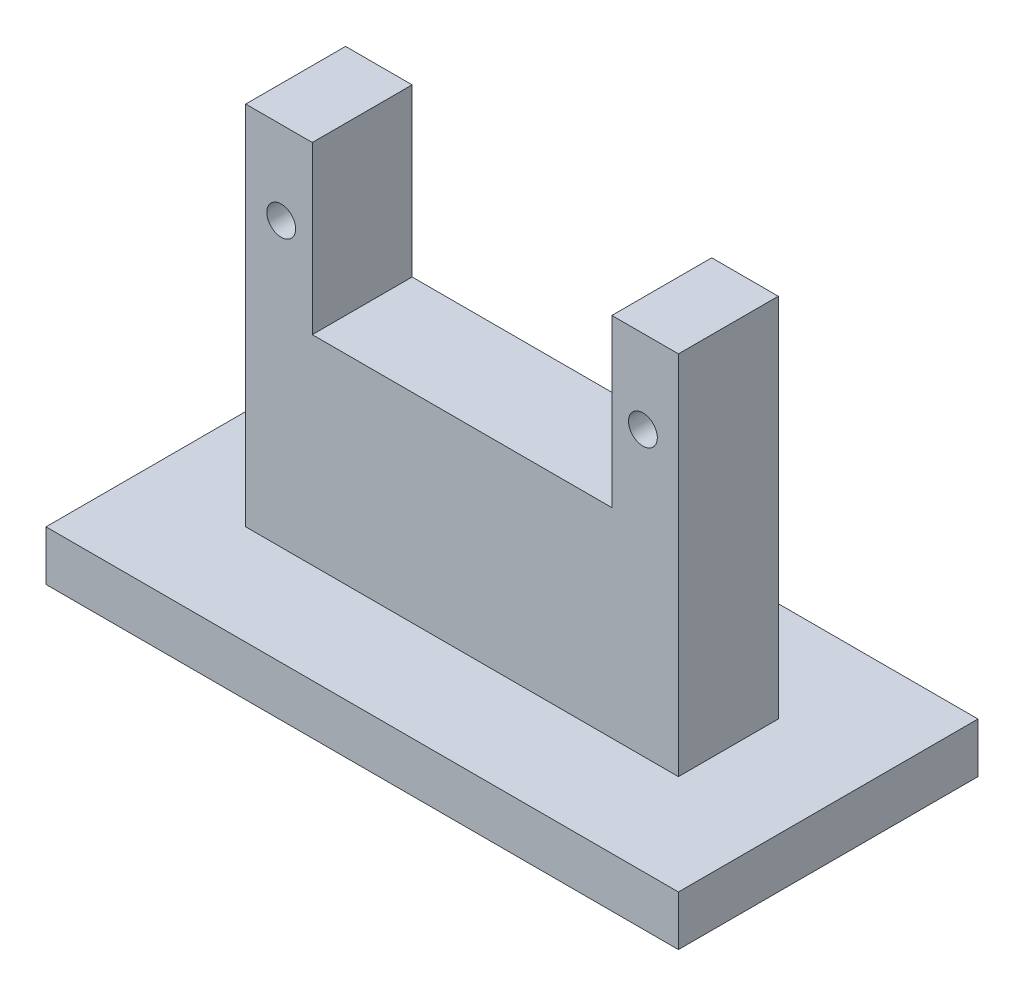
ISO-10303-21;
HEADER;
FILE_DESCRIPTION(('STEP AP214'),'2;1');
FILE_NAME('part.step','',(''),(''),'','','');
FILE_SCHEMA(('AUTOMOTIVE_DESIGN { 1 0 10303 214 1 1 1 1 }'));
ENDSEC;
DATA;
#1=APPLICATION_CONTEXT('core data for automotive mechanical design processes');
#2=APPLICATION_PROTOCOL_DEFINITION('international standard','automotive_design',2000,#1);
#3=PRODUCT_CONTEXT('',#1,'mechanical');
#4=PRODUCT('Part','Part','',(#3));
#5=PRODUCT_RELATED_PRODUCT_CATEGORY('part','',(#4));
#6=PRODUCT_DEFINITION_FORMATION('','',#4);
#7=PRODUCT_DEFINITION_CONTEXT('part definition',#1,'design');
#8=PRODUCT_DEFINITION('design','',#6,#7);
#9=PRODUCT_DEFINITION_SHAPE('','',#8);
#10=(LENGTH_UNIT() NAMED_UNIT(*) SI_UNIT(.MILLI.,.METRE.));
#11=(NAMED_UNIT(*) PLANE_ANGLE_UNIT() SI_UNIT($,.RADIAN.));
#12=(NAMED_UNIT(*) SI_UNIT($,.STERADIAN.) SOLID_ANGLE_UNIT());
#13=UNCERTAINTY_MEASURE_WITH_UNIT(LENGTH_MEASURE(1.E-05),#10,'distance_accuracy_value','');
#14=(GEOMETRIC_REPRESENTATION_CONTEXT(3) GLOBAL_UNCERTAINTY_ASSIGNED_CONTEXT((#13)) GLOBAL_UNIT_ASSIGNED_CONTEXT((#10,
#11,#12)) REPRESENTATION_CONTEXT('',''));
#15=CARTESIAN_POINT('',(0.,0.,0.));
#16=DIRECTION('',(0.,0.,1.));
#17=DIRECTION('',(1.,0.,0.));
#18=AXIS2_PLACEMENT_3D('',#15,#16,#17);
#19=CARTESIAN_POINT('',(-16.51,0.,7.62));
#20=DIRECTION('',(1.,0.,0.));
#21=DIRECTION('',(0.,1.,0.));
#22=AXIS2_PLACEMENT_3D('',#19,#20,#21);
#23=PLANE('',#22);
#24=DIRECTION('',(0.,-1.,0.));
#25=VECTOR('',#24,1.);
#26=CARTESIAN_POINT('',(-16.51,0.,0.));
#27=LINE('',#26,#25);
#28=CARTESIAN_POINT('',(-16.51,31.75,0.));
#29=VERTEX_POINT('',#28);
#30=CARTESIAN_POINT('',(-16.51,3.81,0.));
#31=VERTEX_POINT('',#30);
#32=EDGE_CURVE('E168',#29,#31,#27,.T.);
#33=ORIENTED_EDGE('',*,*,#32,.T.);
#34=DIRECTION('',(0.,0.,1.));
#35=VECTOR('',#34,1.);
#36=CARTESIAN_POINT('',(-16.51,3.81,7.62));
#37=LINE('',#36,#35);
#38=CARTESIAN_POINT('',(-16.51,3.81,7.62));
#39=VERTEX_POINT('',#38);
#40=EDGE_CURVE('E64',#31,#39,#37,.T.);
#41=ORIENTED_EDGE('',*,*,#40,.T.);
#42=DIRECTION('',(0.,-1.,0.));
#43=VECTOR('',#42,1.);
#44=CARTESIAN_POINT('',(-16.51,0.,7.62));
#45=LINE('',#44,#43);
#46=CARTESIAN_POINT('',(-16.51,31.75,7.62));
#47=VERTEX_POINT('',#46);
#48=EDGE_CURVE('E169',#47,#39,#45,.T.);
#49=ORIENTED_EDGE('',*,*,#48,.F.);
#50=DIRECTION('',(0.,0.,-1.));
#51=VECTOR('',#50,1.);
#52=CARTESIAN_POINT('',(-16.51,31.75,7.62));
#53=LINE('',#52,#51);
#54=EDGE_CURVE('E184',#47,#29,#53,.T.);
#55=ORIENTED_EDGE('',*,*,#54,.T.);
#56=EDGE_LOOP('',(#33,#41,#49,#55));
#57=FACE_BOUND('',#56,.T.);
#58=ADVANCED_FACE('F42',(#57),#23,.F.);
#59=CARTESIAN_POINT('',(16.51,0.,7.62));
#60=DIRECTION('',(-1.,0.,0.));
#61=DIRECTION('',(0.,-1.,0.));
#62=AXIS2_PLACEMENT_3D('',#59,#60,#61);
#63=PLANE('',#62);
#64=DIRECTION('',(0.,1.,0.));
#65=VECTOR('',#64,1.);
#66=CARTESIAN_POINT('',(16.51,0.,7.62));
#67=LINE('',#66,#65);
#68=CARTESIAN_POINT('',(16.51,3.81,7.62));
#69=VERTEX_POINT('',#68);
#70=CARTESIAN_POINT('',(16.51,31.75,7.62));
#71=VERTEX_POINT('',#70);
#72=EDGE_CURVE('E171',#69,#71,#67,.T.);
#73=ORIENTED_EDGE('',*,*,#72,.F.);
#74=DIRECTION('',(0.,0.,-1.));
#75=VECTOR('',#74,1.);
#76=CARTESIAN_POINT('',(16.51,3.81,7.62));
#77=LINE('',#76,#75);
#78=CARTESIAN_POINT('',(16.51,3.81,0.));
#79=VERTEX_POINT('',#78);
#80=EDGE_CURVE('E158',#69,#79,#77,.T.);
#81=ORIENTED_EDGE('',*,*,#80,.T.);
#82=DIRECTION('',(0.,1.,0.));
#83=VECTOR('',#82,1.);
#84=CARTESIAN_POINT('',(16.51,0.,0.));
#85=LINE('',#84,#83);
#86=CARTESIAN_POINT('',(16.51,31.75,0.));
#87=VERTEX_POINT('',#86);
#88=EDGE_CURVE('E186',#79,#87,#85,.T.);
#89=ORIENTED_EDGE('',*,*,#88,.T.);
#90=DIRECTION('',(0.,0.,-1.));
#91=VECTOR('',#90,1.);
#92=CARTESIAN_POINT('',(16.51,31.75,7.62));
#93=LINE('',#92,#91);
#94=EDGE_CURVE('E49',#71,#87,#93,.T.);
#95=ORIENTED_EDGE('',*,*,#94,.F.);
#96=EDGE_LOOP('',(#73,#81,#89,#95));
#97=FACE_BOUND('',#96,.T.);
#98=ADVANCED_FACE('F235',(#97),#63,.F.);
#99=CARTESIAN_POINT('',(11.43,31.75,7.62));
#100=DIRECTION('',(0.,-1.,0.));
#101=DIRECTION('',(0.,0.,-1.));
#102=AXIS2_PLACEMENT_3D('',#99,#100,#101);
#103=PLANE('',#102);
#104=DIRECTION('',(-1.,0.,0.));
#105=VECTOR('',#104,1.);
#106=CARTESIAN_POINT('',(11.43,31.75,0.));
#107=LINE('',#106,#105);
#108=CARTESIAN_POINT('',(11.43,31.75,0.));
#109=VERTEX_POINT('',#108);
#110=EDGE_CURVE('E188',#87,#109,#107,.T.);
#111=ORIENTED_EDGE('',*,*,#110,.T.);
#112=DIRECTION('',(0.,0.,-1.));
#113=VECTOR('',#112,1.);
#114=CARTESIAN_POINT('',(11.43,31.75,7.62));
#115=LINE('',#114,#113);
#116=CARTESIAN_POINT('',(11.43,31.75,7.62));
#117=VERTEX_POINT('',#116);
#118=EDGE_CURVE('E208',#117,#109,#115,.T.);
#119=ORIENTED_EDGE('',*,*,#118,.F.);
#120=DIRECTION('',(-1.,0.,0.));
#121=VECTOR('',#120,1.);
#122=CARTESIAN_POINT('',(11.43,31.75,7.62));
#123=LINE('',#122,#121);
#124=EDGE_CURVE('E174',#71,#117,#123,.T.);
#125=ORIENTED_EDGE('',*,*,#124,.F.);
#126=ORIENTED_EDGE('',*,*,#94,.T.);
#127=EDGE_LOOP('',(#111,#119,#125,#126));
#128=FACE_BOUND('',#127,.T.);
#129=ADVANCED_FACE('F215',(#128),#103,.F.);
#130=CARTESIAN_POINT('',(11.43,19.05,7.62));
#131=DIRECTION('',(1.,0.,0.));
#132=DIRECTION('',(0.,1.,0.));
#133=AXIS2_PLACEMENT_3D('',#130,#131,#132);
#134=PLANE('',#133);
#135=DIRECTION('',(0.,-1.,0.));
#136=VECTOR('',#135,1.);
#137=CARTESIAN_POINT('',(11.43,19.05,0.));
#138=LINE('',#137,#136);
#139=CARTESIAN_POINT('',(11.43,19.05,0.));
#140=VERTEX_POINT('',#139);
#141=EDGE_CURVE('E190',#109,#140,#138,.T.);
#142=ORIENTED_EDGE('',*,*,#141,.T.);
#143=DIRECTION('',(0.,0.,-1.));
#144=VECTOR('',#143,1.);
#145=CARTESIAN_POINT('',(11.43,19.05,7.62));
#146=LINE('',#145,#144);
#147=CARTESIAN_POINT('',(11.43,19.05,7.62));
#148=VERTEX_POINT('',#147);
#149=EDGE_CURVE('E205',#148,#140,#146,.T.);
#150=ORIENTED_EDGE('',*,*,#149,.F.);
#151=DIRECTION('',(0.,-1.,0.));
#152=VECTOR('',#151,1.);
#153=CARTESIAN_POINT('',(11.43,19.05,7.62));
#154=LINE('',#153,#152);
#155=EDGE_CURVE('E176',#117,#148,#154,.T.);
#156=ORIENTED_EDGE('',*,*,#155,.F.);
#157=ORIENTED_EDGE('',*,*,#118,.T.);
#158=EDGE_LOOP('',(#142,#150,#156,#157));
#159=FACE_BOUND('',#158,.T.);
#160=ADVANCED_FACE('F225',(#159),#134,.F.);
#161=CARTESIAN_POINT('',(-11.43,19.05,7.62));
#162=DIRECTION('',(0.,-1.,0.));
#163=DIRECTION('',(1.,0.,0.));
#164=AXIS2_PLACEMENT_3D('',#161,#162,#163);
#165=PLANE('',#164);
#166=DIRECTION('',(-1.,0.,0.));
#167=VECTOR('',#166,1.);
#168=CARTESIAN_POINT('',(-11.43,19.05,0.));
#169=LINE('',#168,#167);
#170=CARTESIAN_POINT('',(-11.43,19.05,0.));
#171=VERTEX_POINT('',#170);
#172=EDGE_CURVE('E192',#140,#171,#169,.T.);
#173=ORIENTED_EDGE('',*,*,#172,.T.);
#174=DIRECTION('',(0.,0.,-1.));
#175=VECTOR('',#174,1.);
#176=CARTESIAN_POINT('',(-11.43,19.05,7.62));
#177=LINE('',#176,#175);
#178=CARTESIAN_POINT('',(-11.43,19.05,7.62));
#179=VERTEX_POINT('',#178);
#180=EDGE_CURVE('E202',#179,#171,#177,.T.);
#181=ORIENTED_EDGE('',*,*,#180,.F.);
#182=DIRECTION('',(-1.,0.,0.));
#183=VECTOR('',#182,1.);
#184=CARTESIAN_POINT('',(-11.43,19.05,7.62));
#185=LINE('',#184,#183);
#186=EDGE_CURVE('E178',#148,#179,#185,.T.);
#187=ORIENTED_EDGE('',*,*,#186,.F.);
#188=ORIENTED_EDGE('',*,*,#149,.T.);
#189=EDGE_LOOP('',(#173,#181,#187,#188));
#190=FACE_BOUND('',#189,.T.);
#191=ADVANCED_FACE('F229',(#190),#165,.F.);
#192=CARTESIAN_POINT('',(-11.43,31.75,7.62));
#193=DIRECTION('',(-1.,0.,0.));
#194=DIRECTION('',(0.,-1.,0.));
#195=AXIS2_PLACEMENT_3D('',#192,#193,#194);
#196=PLANE('',#195);
#197=DIRECTION('',(0.,1.,0.));
#198=VECTOR('',#197,1.);
#199=CARTESIAN_POINT('',(-11.43,31.75,0.));
#200=LINE('',#199,#198);
#201=CARTESIAN_POINT('',(-11.43,31.75,0.));
#202=VERTEX_POINT('',#201);
#203=EDGE_CURVE('E194',#171,#202,#200,.T.);
#204=ORIENTED_EDGE('',*,*,#203,.T.);
#205=DIRECTION('',(0.,0.,-1.));
#206=VECTOR('',#205,1.);
#207=CARTESIAN_POINT('',(-11.43,31.75,7.62));
#208=LINE('',#207,#206);
#209=CARTESIAN_POINT('',(-11.43,31.75,7.62));
#210=VERTEX_POINT('',#209);
#211=EDGE_CURVE('E199',#210,#202,#208,.T.);
#212=ORIENTED_EDGE('',*,*,#211,.F.);
#213=DIRECTION('',(0.,1.,0.));
#214=VECTOR('',#213,1.);
#215=CARTESIAN_POINT('',(-11.43,31.75,7.62));
#216=LINE('',#215,#214);
#217=EDGE_CURVE('E180',#179,#210,#216,.T.);
#218=ORIENTED_EDGE('',*,*,#217,.F.);
#219=ORIENTED_EDGE('',*,*,#180,.T.);
#220=EDGE_LOOP('',(#204,#212,#218,#219));
#221=FACE_BOUND('',#220,.T.);
#222=ADVANCED_FACE('F243',(#221),#196,.F.);
#223=CARTESIAN_POINT('',(-16.51,31.75,7.62));
#224=DIRECTION('',(0.,-1.,0.));
#225=DIRECTION('',(0.,0.,-1.));
#226=AXIS2_PLACEMENT_3D('',#223,#224,#225);
#227=PLANE('',#226);
#228=DIRECTION('',(-1.,0.,0.));
#229=VECTOR('',#228,1.);
#230=CARTESIAN_POINT('',(-16.51,31.75,0.));
#231=LINE('',#230,#229);
#232=EDGE_CURVE('E172',#202,#29,#231,.T.);
#233=ORIENTED_EDGE('',*,*,#232,.T.);
#234=ORIENTED_EDGE('',*,*,#54,.F.);
#235=DIRECTION('',(-1.,0.,0.));
#236=VECTOR('',#235,1.);
#237=CARTESIAN_POINT('',(-16.51,31.75,7.62));
#238=LINE('',#237,#236);
#239=EDGE_CURVE('E182',#210,#47,#238,.T.);
#240=ORIENTED_EDGE('',*,*,#239,.F.);
#241=ORIENTED_EDGE('',*,*,#211,.T.);
#242=EDGE_LOOP('',(#233,#234,#240,#241));
#243=FACE_BOUND('',#242,.T.);
#244=ADVANCED_FACE('F241',(#243),#227,.F.);
#245=CARTESIAN_POINT('',(0.,0.,7.62));
#246=DIRECTION('',(0.,0.,-1.));
#247=DIRECTION('',(-1.,0.,0.));
#248=AXIS2_PLACEMENT_3D('',#245,#246,#247);
#249=PLANE('',#248);
#250=CARTESIAN_POINT('',(13.8,25.4,7.62));
#251=DIRECTION('',(0.,0.,-1.));
#252=DIRECTION('',(-1.,0.,0.));
#253=AXIS2_PLACEMENT_3D('',#250,#251,#252);
#254=CIRCLE('',#253,1.09999999999999);
#255=CARTESIAN_POINT('',(12.7,25.4,7.62));
#256=VERTEX_POINT('',#255);
#257=EDGE_CURVE('E301',#256,#256,#254,.T.);
#258=ORIENTED_EDGE('',*,*,#257,.T.);
#259=EDGE_LOOP('',(#258));
#260=FACE_BOUND('',#259,.T.);
#261=CARTESIAN_POINT('',(-13.8,25.4,7.62));
#262=DIRECTION('',(0.,0.,-1.));
#263=DIRECTION('',(-1.,0.,0.));
#264=AXIS2_PLACEMENT_3D('',#261,#262,#263);
#265=CIRCLE('',#264,1.09999999999999);
#266=CARTESIAN_POINT('',(-14.9,25.4,7.62));
#267=VERTEX_POINT('',#266);
#268=EDGE_CURVE('E282',#267,#267,#265,.T.);
#269=ORIENTED_EDGE('',*,*,#268,.T.);
#270=EDGE_LOOP('',(#269));
#271=FACE_BOUND('',#270,.T.);
#272=ORIENTED_EDGE('',*,*,#48,.T.);
#273=DIRECTION('',(1.,0.,0.));
#274=VECTOR('',#273,1.);
#275=CARTESIAN_POINT('',(0.,3.81,7.62));
#276=LINE('',#275,#274);
#277=EDGE_CURVE('E56',#39,#69,#276,.T.);
#278=ORIENTED_EDGE('',*,*,#277,.T.);
#279=ORIENTED_EDGE('',*,*,#72,.T.);
#280=ORIENTED_EDGE('',*,*,#124,.T.);
#281=ORIENTED_EDGE('',*,*,#155,.T.);
#282=ORIENTED_EDGE('',*,*,#186,.T.);
#283=ORIENTED_EDGE('',*,*,#217,.T.);
#284=ORIENTED_EDGE('',*,*,#239,.T.);
#285=EDGE_LOOP('',(#272,#278,#279,#280,#281,#282,#283,#284));
#286=FACE_BOUND('',#285,.T.);
#287=ADVANCED_FACE('F232',(#260,#271,#286),#249,.F.);
#288=CARTESIAN_POINT('',(0.,0.,0.));
#289=DIRECTION('',(0.,0.,-1.));
#290=DIRECTION('',(-1.,0.,0.));
#291=AXIS2_PLACEMENT_3D('',#288,#289,#290);
#292=PLANE('',#291);
#293=CARTESIAN_POINT('',(13.8,25.4,0.));
#294=DIRECTION('',(0.,0.,-1.));
#295=DIRECTION('',(-1.,0.,0.));
#296=AXIS2_PLACEMENT_3D('',#293,#294,#295);
#297=CIRCLE('',#296,1.09999999999999);
#298=CARTESIAN_POINT('',(12.7,25.4,0.));
#299=VERTEX_POINT('',#298);
#300=EDGE_CURVE('E304',#299,#299,#297,.T.);
#301=ORIENTED_EDGE('',*,*,#300,.F.);
#302=EDGE_LOOP('',(#301));
#303=FACE_BOUND('',#302,.T.);
#304=CARTESIAN_POINT('',(-13.8,25.4,0.));
#305=DIRECTION('',(0.,0.,-1.));
#306=DIRECTION('',(-1.,0.,0.));
#307=AXIS2_PLACEMENT_3D('',#304,#305,#306);
#308=CIRCLE('',#307,1.09999999999999);
#309=CARTESIAN_POINT('',(-14.9,25.4,0.));
#310=VERTEX_POINT('',#309);
#311=EDGE_CURVE('E287',#310,#310,#308,.T.);
#312=ORIENTED_EDGE('',*,*,#311,.F.);
#313=EDGE_LOOP('',(#312));
#314=FACE_BOUND('',#313,.T.);
#315=DIRECTION('',(1.,0.,0.));
#316=VECTOR('',#315,1.);
#317=CARTESIAN_POINT('',(0.,3.81,0.));
#318=LINE('',#317,#316);
#319=EDGE_CURVE('E11',#31,#79,#318,.T.);
#320=ORIENTED_EDGE('',*,*,#319,.F.);
#321=ORIENTED_EDGE('',*,*,#32,.F.);
#322=ORIENTED_EDGE('',*,*,#232,.F.);
#323=ORIENTED_EDGE('',*,*,#203,.F.);
#324=ORIENTED_EDGE('',*,*,#172,.F.);
#325=ORIENTED_EDGE('',*,*,#141,.F.);
#326=ORIENTED_EDGE('',*,*,#110,.F.);
#327=ORIENTED_EDGE('',*,*,#88,.F.);
#328=EDGE_LOOP('',(#320,#321,#322,#323,#324,#325,#326,#327));
#329=FACE_BOUND('',#328,.T.);
#330=ADVANCED_FACE('F220',(#303,#314,#329),#292,.T.);
#331=CARTESIAN_POINT('',(0.,3.81,0.));
#332=DIRECTION('',(0.,1.,0.));
#333=DIRECTION('',(0.,0.,1.));
#334=AXIS2_PLACEMENT_3D('',#331,#332,#333);
#335=PLANE('',#334);
#336=DIRECTION('',(0.,0.,-1.));
#337=VECTOR('',#336,1.);
#338=CARTESIAN_POINT('',(24.13,3.81,15.24));
#339=LINE('',#338,#337);
#340=CARTESIAN_POINT('',(24.13,3.81,15.24));
#341=VERTEX_POINT('',#340);
#342=CARTESIAN_POINT('',(24.13,3.81,-7.62));
#343=VERTEX_POINT('',#342);
#344=EDGE_CURVE('E143',#341,#343,#339,.T.);
#345=ORIENTED_EDGE('',*,*,#344,.T.);
#346=DIRECTION('',(-1.,0.,0.));
#347=VECTOR('',#346,1.);
#348=CARTESIAN_POINT('',(24.13,3.81,-7.62));
#349=LINE('',#348,#347);
#350=CARTESIAN_POINT('',(-24.13,3.81,-7.62));
#351=VERTEX_POINT('',#350);
#352=EDGE_CURVE('E132',#343,#351,#349,.T.);
#353=ORIENTED_EDGE('',*,*,#352,.T.);
#354=DIRECTION('',(0.,0.,1.));
#355=VECTOR('',#354,1.);
#356=CARTESIAN_POINT('',(-24.13,3.81,-7.62));
#357=LINE('',#356,#355);
#358=CARTESIAN_POINT('',(-24.13,3.81,15.24));
#359=VERTEX_POINT('',#358);
#360=EDGE_CURVE('E142',#351,#359,#357,.T.);
#361=ORIENTED_EDGE('',*,*,#360,.T.);
#362=DIRECTION('',(1.,0.,0.));
#363=VECTOR('',#362,1.);
#364=CARTESIAN_POINT('',(-24.13,3.81,15.24));
#365=LINE('',#364,#363);
#366=EDGE_CURVE('E149',#359,#341,#365,.T.);
#367=ORIENTED_EDGE('',*,*,#366,.T.);
#368=EDGE_LOOP('',(#345,#353,#361,#367));
#369=FACE_BOUND('',#368,.T.);
#370=ORIENTED_EDGE('',*,*,#277,.F.);
#371=ORIENTED_EDGE('',*,*,#40,.F.);
#372=ORIENTED_EDGE('',*,*,#319,.T.);
#373=ORIENTED_EDGE('',*,*,#80,.F.);
#374=EDGE_LOOP('',(#370,#371,#372,#373));
#375=FACE_BOUND('',#374,.T.);
#376=ADVANCED_FACE('F146',(#369,#375),#335,.T.);
#377=CARTESIAN_POINT('',(24.13,3.81,15.24));
#378=DIRECTION('',(-1.,0.,0.));
#379=DIRECTION('',(0.,0.,1.));
#380=AXIS2_PLACEMENT_3D('',#377,#378,#379);
#381=PLANE('',#380);
#382=DIRECTION('',(0.,0.,-1.));
#383=VECTOR('',#382,1.);
#384=CARTESIAN_POINT('',(24.13,0.,15.24));
#385=LINE('',#384,#383);
#386=CARTESIAN_POINT('',(24.13,0.,15.24));
#387=VERTEX_POINT('',#386);
#388=CARTESIAN_POINT('',(24.13,0.,-7.62));
#389=VERTEX_POINT('',#388);
#390=EDGE_CURVE('E157',#387,#389,#385,.T.);
#391=ORIENTED_EDGE('',*,*,#390,.T.);
#392=DIRECTION('',(0.,-1.,0.));
#393=VECTOR('',#392,1.);
#394=CARTESIAN_POINT('',(24.13,3.81,-7.62));
#395=LINE('',#394,#393);
#396=EDGE_CURVE('E136',#343,#389,#395,.T.);
#397=ORIENTED_EDGE('',*,*,#396,.F.);
#398=ORIENTED_EDGE('',*,*,#344,.F.);
#399=DIRECTION('',(0.,-1.,0.));
#400=VECTOR('',#399,1.);
#401=CARTESIAN_POINT('',(24.13,3.81,15.24));
#402=LINE('',#401,#400);
#403=EDGE_CURVE('E294',#341,#387,#402,.T.);
#404=ORIENTED_EDGE('',*,*,#403,.T.);
#405=EDGE_LOOP('',(#391,#397,#398,#404));
#406=FACE_BOUND('',#405,.T.);
#407=ADVANCED_FACE('F155',(#406),#381,.F.);
#408=CARTESIAN_POINT('',(24.13,3.81,-7.62));
#409=DIRECTION('',(0.,0.,1.));
#410=DIRECTION('',(1.,0.,0.));
#411=AXIS2_PLACEMENT_3D('',#408,#409,#410);
#412=PLANE('',#411);
#413=DIRECTION('',(-1.,0.,0.));
#414=VECTOR('',#413,1.);
#415=CARTESIAN_POINT('',(24.13,0.,-7.62));
#416=LINE('',#415,#414);
#417=CARTESIAN_POINT('',(-24.13,0.,-7.62));
#418=VERTEX_POINT('',#417);
#419=EDGE_CURVE('E281',#389,#418,#416,.T.);
#420=ORIENTED_EDGE('',*,*,#419,.T.);
#421=DIRECTION('',(0.,-1.,0.));
#422=VECTOR('',#421,1.);
#423=CARTESIAN_POINT('',(-24.13,3.81,-7.62));
#424=LINE('',#423,#422);
#425=EDGE_CURVE('E139',#351,#418,#424,.T.);
#426=ORIENTED_EDGE('',*,*,#425,.F.);
#427=ORIENTED_EDGE('',*,*,#352,.F.);
#428=ORIENTED_EDGE('',*,*,#396,.T.);
#429=EDGE_LOOP('',(#420,#426,#427,#428));
#430=FACE_BOUND('',#429,.T.);
#431=ADVANCED_FACE('F134',(#430),#412,.F.);
#432=CARTESIAN_POINT('',(-24.13,3.81,-7.62));
#433=DIRECTION('',(1.,0.,0.));
#434=DIRECTION('',(0.,0.,-1.));
#435=AXIS2_PLACEMENT_3D('',#432,#433,#434);
#436=PLANE('',#435);
#437=DIRECTION('',(0.,0.,1.));
#438=VECTOR('',#437,1.);
#439=CARTESIAN_POINT('',(-24.13,0.,-7.62));
#440=LINE('',#439,#438);
#441=CARTESIAN_POINT('',(-24.13,0.,15.24));
#442=VERTEX_POINT('',#441);
#443=EDGE_CURVE('E284',#418,#442,#440,.T.);
#444=ORIENTED_EDGE('',*,*,#443,.T.);
#445=DIRECTION('',(0.,-1.,0.));
#446=VECTOR('',#445,1.);
#447=CARTESIAN_POINT('',(-24.13,3.81,15.24));
#448=LINE('',#447,#446);
#449=EDGE_CURVE('E162',#359,#442,#448,.T.);
#450=ORIENTED_EDGE('',*,*,#449,.F.);
#451=ORIENTED_EDGE('',*,*,#360,.F.);
#452=ORIENTED_EDGE('',*,*,#425,.T.);
#453=EDGE_LOOP('',(#444,#450,#451,#452));
#454=FACE_BOUND('',#453,.T.);
#455=ADVANCED_FACE('F276',(#454),#436,.F.);
#456=CARTESIAN_POINT('',(-24.13,3.81,15.24));
#457=DIRECTION('',(0.,0.,-1.));
#458=DIRECTION('',(-1.,0.,0.));
#459=AXIS2_PLACEMENT_3D('',#456,#457,#458);
#460=PLANE('',#459);
#461=DIRECTION('',(1.,0.,0.));
#462=VECTOR('',#461,1.);
#463=CARTESIAN_POINT('',(-24.13,0.,15.24));
#464=LINE('',#463,#462);
#465=EDGE_CURVE('E153',#442,#387,#464,.T.);
#466=ORIENTED_EDGE('',*,*,#465,.T.);
#467=ORIENTED_EDGE('',*,*,#403,.F.);
#468=ORIENTED_EDGE('',*,*,#366,.F.);
#469=ORIENTED_EDGE('',*,*,#449,.T.);
#470=EDGE_LOOP('',(#466,#467,#468,#469));
#471=FACE_BOUND('',#470,.T.);
#472=ADVANCED_FACE('F266',(#471),#460,.F.);
#473=CARTESIAN_POINT('',(-16.51,0.,7.62));
#474=DIRECTION('',(0.,1.,0.));
#475=DIRECTION('',(-1.,0.,0.));
#476=AXIS2_PLACEMENT_3D('',#473,#474,#475);
#477=PLANE('',#476);
#478=ORIENTED_EDGE('',*,*,#390,.F.);
#479=ORIENTED_EDGE('',*,*,#465,.F.);
#480=ORIENTED_EDGE('',*,*,#443,.F.);
#481=ORIENTED_EDGE('',*,*,#419,.F.);
#482=EDGE_LOOP('',(#478,#479,#480,#481));
#483=FACE_BOUND('',#482,.T.);
#484=ADVANCED_FACE('F263',(#483),#477,.F.);
#485=CARTESIAN_POINT('',(-13.8,25.4,0.));
#486=DIRECTION('',(0.,0.,-1.));
#487=DIRECTION('',(-1.,0.,0.));
#488=AXIS2_PLACEMENT_3D('',#485,#486,#487);
#489=CYLINDRICAL_SURFACE('',#488,1.09999999999999);
#490=ORIENTED_EDGE('',*,*,#311,.T.);
#491=EDGE_LOOP('',(#490));
#492=FACE_BOUND('',#491,.T.);
#493=ORIENTED_EDGE('',*,*,#268,.F.);
#494=EDGE_LOOP('',(#493));
#495=FACE_BOUND('',#494,.T.);
#496=ADVANCED_FACE('F265',(#492,#495),#489,.F.);
#497=CARTESIAN_POINT('',(13.8,25.4,0.));
#498=DIRECTION('',(0.,0.,-1.));
#499=DIRECTION('',(-1.,0.,0.));
#500=AXIS2_PLACEMENT_3D('',#497,#498,#499);
#501=CYLINDRICAL_SURFACE('',#500,1.09999999999999);
#502=ORIENTED_EDGE('',*,*,#300,.T.);
#503=EDGE_LOOP('',(#502));
#504=FACE_BOUND('',#503,.T.);
#505=ORIENTED_EDGE('',*,*,#257,.F.);
#506=EDGE_LOOP('',(#505));
#507=FACE_BOUND('',#506,.T.);
#508=ADVANCED_FACE('F273',(#504,#507),#501,.F.);
#509=CLOSED_SHELL('',(#58,#98,#129,#160,#191,#222,#244,#287,#330,#376,#407,#431,#455,#472,#484,
#496,#508));
#510=MANIFOLD_SOLID_BREP('B2',#509);
#511=ADVANCED_BREP_SHAPE_REPRESENTATION('',(#18,#510),#14);
#512=SHAPE_DEFINITION_REPRESENTATION(#9,#511);
ENDSEC;
END-ISO-10303-21;
